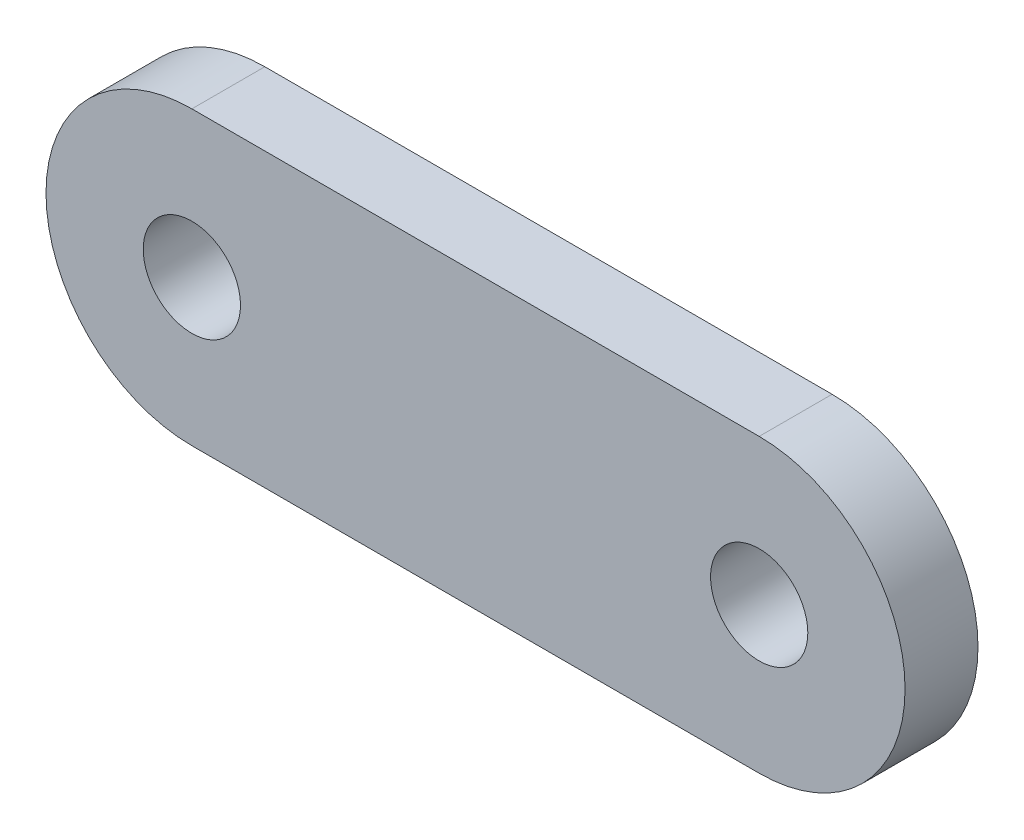
ISO-10303-21;
HEADER;
FILE_DESCRIPTION(('STEP AP214'),'2;1');
FILE_NAME('part.step','',(''),(''),'','','');
FILE_SCHEMA(('AUTOMOTIVE_DESIGN { 1 0 10303 214 1 1 1 1 }'));
ENDSEC;
DATA;
#1=APPLICATION_CONTEXT('core data for automotive mechanical design processes');
#2=APPLICATION_PROTOCOL_DEFINITION('international standard','automotive_design',2000,#1);
#3=PRODUCT_CONTEXT('',#1,'mechanical');
#4=PRODUCT('Part','Part','',(#3));
#5=PRODUCT_RELATED_PRODUCT_CATEGORY('part','',(#4));
#6=PRODUCT_DEFINITION_FORMATION('','',#4);
#7=PRODUCT_DEFINITION_CONTEXT('part definition',#1,'design');
#8=PRODUCT_DEFINITION('design','',#6,#7);
#9=PRODUCT_DEFINITION_SHAPE('','',#8);
#10=(LENGTH_UNIT() NAMED_UNIT(*) SI_UNIT(.MILLI.,.METRE.));
#11=(NAMED_UNIT(*) PLANE_ANGLE_UNIT() SI_UNIT($,.RADIAN.));
#12=(NAMED_UNIT(*) SI_UNIT($,.STERADIAN.) SOLID_ANGLE_UNIT());
#13=UNCERTAINTY_MEASURE_WITH_UNIT(LENGTH_MEASURE(1.E-05),#10,'distance_accuracy_value','');
#14=(GEOMETRIC_REPRESENTATION_CONTEXT(3) GLOBAL_UNCERTAINTY_ASSIGNED_CONTEXT((#13)) GLOBAL_UNIT_ASSIGNED_CONTEXT((#10,
#11,#12)) REPRESENTATION_CONTEXT('',''));
#15=CARTESIAN_POINT('',(0.,0.,0.));
#16=DIRECTION('',(0.,0.,1.));
#17=DIRECTION('',(1.,0.,0.));
#18=AXIS2_PLACEMENT_3D('',#15,#16,#17);
#19=CARTESIAN_POINT('',(-35.3127241673783,0.,3.));
#20=DIRECTION('',(0.,0.,1.));
#21=DIRECTION('',(1.,0.,0.));
#22=AXIS2_PLACEMENT_3D('',#19,#20,#21);
#23=PLANE('',#22);
#24=CARTESIAN_POINT('',(-35.3127241673783,0.,3.));
#25=DIRECTION('',(0.,0.,1.));
#26=DIRECTION('',(1.,0.,0.));
#27=AXIS2_PLACEMENT_3D('',#24,#25,#26);
#28=CIRCLE('',#27,2.);
#29=CARTESIAN_POINT('',(-33.3127241673783,0.,3.));
#30=VERTEX_POINT('',#29);
#31=EDGE_CURVE('E100',#30,#30,#28,.T.);
#32=ORIENTED_EDGE('',*,*,#31,.F.);
#33=EDGE_LOOP('',(#32));
#34=FACE_BOUND('',#33,.T.);
#35=CARTESIAN_POINT('',(-35.3127241673783,0.,3.));
#36=DIRECTION('',(0.,0.,1.));
#37=DIRECTION('',(1.,0.,0.));
#38=AXIS2_PLACEMENT_3D('',#35,#36,#37);
#39=CIRCLE('',#38,6.);
#40=CARTESIAN_POINT('',(-35.3127241673783,6.,3.));
#41=VERTEX_POINT('',#40);
#42=CARTESIAN_POINT('',(-35.3127241673783,-6.,3.));
#43=VERTEX_POINT('',#42);
#44=EDGE_CURVE('E85',#41,#43,#39,.T.);
#45=ORIENTED_EDGE('',*,*,#44,.T.);
#46=DIRECTION('',(1.,0.,0.));
#47=VECTOR('',#46,1.);
#48=CARTESIAN_POINT('',(-35.3127241673783,-6.,3.));
#49=LINE('',#48,#47);
#50=CARTESIAN_POINT('',(-11.9786241673783,-6.,3.));
#51=VERTEX_POINT('',#50);
#52=EDGE_CURVE('E80',#43,#51,#49,.T.);
#53=ORIENTED_EDGE('',*,*,#52,.T.);
#54=CARTESIAN_POINT('',(-11.9786241673783,0.,3.));
#55=DIRECTION('',(0.,0.,1.));
#56=DIRECTION('',(1.,0.,0.));
#57=AXIS2_PLACEMENT_3D('',#54,#55,#56);
#58=CIRCLE('',#57,6.);
#59=CARTESIAN_POINT('',(-11.9786241673783,6.,3.));
#60=VERTEX_POINT('',#59);
#61=EDGE_CURVE('E83',#51,#60,#58,.T.);
#62=ORIENTED_EDGE('',*,*,#61,.T.);
#63=DIRECTION('',(-1.,0.,0.));
#64=VECTOR('',#63,1.);
#65=CARTESIAN_POINT('',(-35.3127241673783,6.,3.));
#66=LINE('',#65,#64);
#67=EDGE_CURVE('E50',#60,#41,#66,.T.);
#68=ORIENTED_EDGE('',*,*,#67,.T.);
#69=EDGE_LOOP('',(#45,#53,#62,#68));
#70=FACE_BOUND('',#69,.T.);
#71=CARTESIAN_POINT('',(-11.9786241673783,0.,3.));
#72=DIRECTION('',(0.,0.,1.));
#73=DIRECTION('',(1.,0.,0.));
#74=AXIS2_PLACEMENT_3D('',#71,#72,#73);
#75=CIRCLE('',#74,2.);
#76=CARTESIAN_POINT('',(-9.97862416737829,0.,3.));
#77=VERTEX_POINT('',#76);
#78=EDGE_CURVE('E115',#77,#77,#75,.T.);
#79=ORIENTED_EDGE('',*,*,#78,.F.);
#80=EDGE_LOOP('',(#79));
#81=FACE_BOUND('',#80,.T.);
#82=ADVANCED_FACE('F33',(#34,#70,#81),#23,.T.);
#83=CARTESIAN_POINT('',(-35.3127241673783,0.,0.));
#84=DIRECTION('',(0.,0.,1.));
#85=DIRECTION('',(1.,0.,0.));
#86=AXIS2_PLACEMENT_3D('',#83,#84,#85);
#87=PLANE('',#86);
#88=CARTESIAN_POINT('',(-35.3127241673783,0.,0.));
#89=DIRECTION('',(0.,0.,1.));
#90=DIRECTION('',(1.,0.,0.));
#91=AXIS2_PLACEMENT_3D('',#88,#89,#90);
#92=CIRCLE('',#91,2.);
#93=CARTESIAN_POINT('',(-33.3127241673783,0.,0.));
#94=VERTEX_POINT('',#93);
#95=EDGE_CURVE('E112',#94,#94,#92,.T.);
#96=ORIENTED_EDGE('',*,*,#95,.T.);
#97=EDGE_LOOP('',(#96));
#98=FACE_BOUND('',#97,.T.);
#99=CARTESIAN_POINT('',(-35.3127241673783,0.,0.));
#100=DIRECTION('',(0.,0.,1.));
#101=DIRECTION('',(1.,0.,0.));
#102=AXIS2_PLACEMENT_3D('',#99,#100,#101);
#103=CIRCLE('',#102,6.);
#104=CARTESIAN_POINT('',(-35.3127241673783,6.,0.));
#105=VERTEX_POINT('',#104);
#106=CARTESIAN_POINT('',(-35.3127241673783,-6.,0.));
#107=VERTEX_POINT('',#106);
#108=EDGE_CURVE('E97',#105,#107,#103,.T.);
#109=ORIENTED_EDGE('',*,*,#108,.F.);
#110=DIRECTION('',(-1.,0.,0.));
#111=VECTOR('',#110,1.);
#112=CARTESIAN_POINT('',(-35.3127241673783,6.,0.));
#113=LINE('',#112,#111);
#114=CARTESIAN_POINT('',(-11.9786241673783,6.,0.));
#115=VERTEX_POINT('',#114);
#116=EDGE_CURVE('E73',#115,#105,#113,.T.);
#117=ORIENTED_EDGE('',*,*,#116,.F.);
#118=CARTESIAN_POINT('',(-11.9786241673783,0.,0.));
#119=DIRECTION('',(0.,0.,1.));
#120=DIRECTION('',(1.,0.,0.));
#121=AXIS2_PLACEMENT_3D('',#118,#119,#120);
#122=CIRCLE('',#121,6.);
#123=CARTESIAN_POINT('',(-11.9786241673783,-6.,0.));
#124=VERTEX_POINT('',#123);
#125=EDGE_CURVE('E67',#124,#115,#122,.T.);
#126=ORIENTED_EDGE('',*,*,#125,.F.);
#127=DIRECTION('',(1.,0.,0.));
#128=VECTOR('',#127,1.);
#129=CARTESIAN_POINT('',(-35.3127241673783,-6.,0.));
#130=LINE('',#129,#128);
#131=EDGE_CURVE('E89',#107,#124,#130,.T.);
#132=ORIENTED_EDGE('',*,*,#131,.F.);
#133=EDGE_LOOP('',(#109,#117,#126,#132));
#134=FACE_BOUND('',#133,.T.);
#135=CARTESIAN_POINT('',(-11.9786241673783,0.,0.));
#136=DIRECTION('',(0.,0.,1.));
#137=DIRECTION('',(1.,0.,0.));
#138=AXIS2_PLACEMENT_3D('',#135,#136,#137);
#139=CIRCLE('',#138,2.);
#140=CARTESIAN_POINT('',(-9.97862416737829,0.,0.));
#141=VERTEX_POINT('',#140);
#142=EDGE_CURVE('E118',#141,#141,#139,.T.);
#143=ORIENTED_EDGE('',*,*,#142,.T.);
#144=EDGE_LOOP('',(#143));
#145=FACE_BOUND('',#144,.T.);
#146=ADVANCED_FACE('F108',(#98,#134,#145),#87,.F.);
#147=CARTESIAN_POINT('',(-35.3127241673783,0.,3.));
#148=DIRECTION('',(0.,0.,-1.));
#149=DIRECTION('',(-1.,0.,0.));
#150=AXIS2_PLACEMENT_3D('',#147,#148,#149);
#151=CYLINDRICAL_SURFACE('',#150,6.);
#152=ORIENTED_EDGE('',*,*,#108,.T.);
#153=DIRECTION('',(0.,0.,-1.));
#154=VECTOR('',#153,1.);
#155=CARTESIAN_POINT('',(-35.3127241673783,-6.,3.));
#156=LINE('',#155,#154);
#157=EDGE_CURVE('E11',#43,#107,#156,.T.);
#158=ORIENTED_EDGE('',*,*,#157,.F.);
#159=ORIENTED_EDGE('',*,*,#44,.F.);
#160=DIRECTION('',(0.,0.,-1.));
#161=VECTOR('',#160,1.);
#162=CARTESIAN_POINT('',(-35.3127241673783,6.,3.));
#163=LINE('',#162,#161);
#164=EDGE_CURVE('E93',#41,#105,#163,.T.);
#165=ORIENTED_EDGE('',*,*,#164,.T.);
#166=EDGE_LOOP('',(#152,#158,#159,#165));
#167=FACE_BOUND('',#166,.T.);
#168=ADVANCED_FACE('F35',(#167),#151,.T.);
#169=CARTESIAN_POINT('',(-35.3127241673783,-6.,3.));
#170=DIRECTION('',(0.,1.,0.));
#171=DIRECTION('',(0.,0.,1.));
#172=AXIS2_PLACEMENT_3D('',#169,#170,#171);
#173=PLANE('',#172);
#174=ORIENTED_EDGE('',*,*,#131,.T.);
#175=DIRECTION('',(0.,0.,-1.));
#176=VECTOR('',#175,1.);
#177=CARTESIAN_POINT('',(-11.9786241673783,-6.,3.));
#178=LINE('',#177,#176);
#179=EDGE_CURVE('E42',#51,#124,#178,.T.);
#180=ORIENTED_EDGE('',*,*,#179,.F.);
#181=ORIENTED_EDGE('',*,*,#52,.F.);
#182=ORIENTED_EDGE('',*,*,#157,.T.);
#183=EDGE_LOOP('',(#174,#180,#181,#182));
#184=FACE_BOUND('',#183,.T.);
#185=ADVANCED_FACE('F88',(#184),#173,.F.);
#186=CARTESIAN_POINT('',(-11.9786241673783,0.,3.));
#187=DIRECTION('',(0.,0.,-1.));
#188=DIRECTION('',(-1.,0.,0.));
#189=AXIS2_PLACEMENT_3D('',#186,#187,#188);
#190=CYLINDRICAL_SURFACE('',#189,6.);
#191=ORIENTED_EDGE('',*,*,#125,.T.);
#192=DIRECTION('',(0.,0.,-1.));
#193=VECTOR('',#192,1.);
#194=CARTESIAN_POINT('',(-11.9786241673783,6.,3.));
#195=LINE('',#194,#193);
#196=EDGE_CURVE('E90',#60,#115,#195,.T.);
#197=ORIENTED_EDGE('',*,*,#196,.F.);
#198=ORIENTED_EDGE('',*,*,#61,.F.);
#199=ORIENTED_EDGE('',*,*,#179,.T.);
#200=EDGE_LOOP('',(#191,#197,#198,#199));
#201=FACE_BOUND('',#200,.T.);
#202=ADVANCED_FACE('F91',(#201),#190,.T.);
#203=CARTESIAN_POINT('',(-35.3127241673783,6.,3.));
#204=DIRECTION('',(0.,-1.,0.));
#205=DIRECTION('',(0.,0.,-1.));
#206=AXIS2_PLACEMENT_3D('',#203,#204,#205);
#207=PLANE('',#206);
#208=ORIENTED_EDGE('',*,*,#116,.T.);
#209=ORIENTED_EDGE('',*,*,#164,.F.);
#210=ORIENTED_EDGE('',*,*,#67,.F.);
#211=ORIENTED_EDGE('',*,*,#196,.T.);
#212=EDGE_LOOP('',(#208,#209,#210,#211));
#213=FACE_BOUND('',#212,.T.);
#214=ADVANCED_FACE('F105',(#213),#207,.F.);
#215=CARTESIAN_POINT('',(-35.3127241673783,0.,3.));
#216=DIRECTION('',(0.,0.,-1.));
#217=DIRECTION('',(-1.,0.,0.));
#218=AXIS2_PLACEMENT_3D('',#215,#216,#217);
#219=CYLINDRICAL_SURFACE('',#218,2.);
#220=ORIENTED_EDGE('',*,*,#31,.T.);
#221=EDGE_LOOP('',(#220));
#222=FACE_BOUND('',#221,.T.);
#223=ORIENTED_EDGE('',*,*,#95,.F.);
#224=EDGE_LOOP('',(#223));
#225=FACE_BOUND('',#224,.T.);
#226=ADVANCED_FACE('F136',(#222,#225),#219,.F.);
#227=CARTESIAN_POINT('',(-11.9786241673783,0.,3.));
#228=DIRECTION('',(0.,0.,-1.));
#229=DIRECTION('',(-1.,0.,0.));
#230=AXIS2_PLACEMENT_3D('',#227,#228,#229);
#231=CYLINDRICAL_SURFACE('',#230,2.);
#232=ORIENTED_EDGE('',*,*,#78,.T.);
#233=EDGE_LOOP('',(#232));
#234=FACE_BOUND('',#233,.T.);
#235=ORIENTED_EDGE('',*,*,#142,.F.);
#236=EDGE_LOOP('',(#235));
#237=FACE_BOUND('',#236,.T.);
#238=ADVANCED_FACE('F124',(#234,#237),#231,.F.);
#239=CLOSED_SHELL('',(#82,#146,#168,#185,#202,#214,#226,#238));
#240=MANIFOLD_SOLID_BREP('B2',#239);
#241=ADVANCED_BREP_SHAPE_REPRESENTATION('',(#18,#240),#14);
#242=SHAPE_DEFINITION_REPRESENTATION(#9,#241);
ENDSEC;
END-ISO-10303-21;
